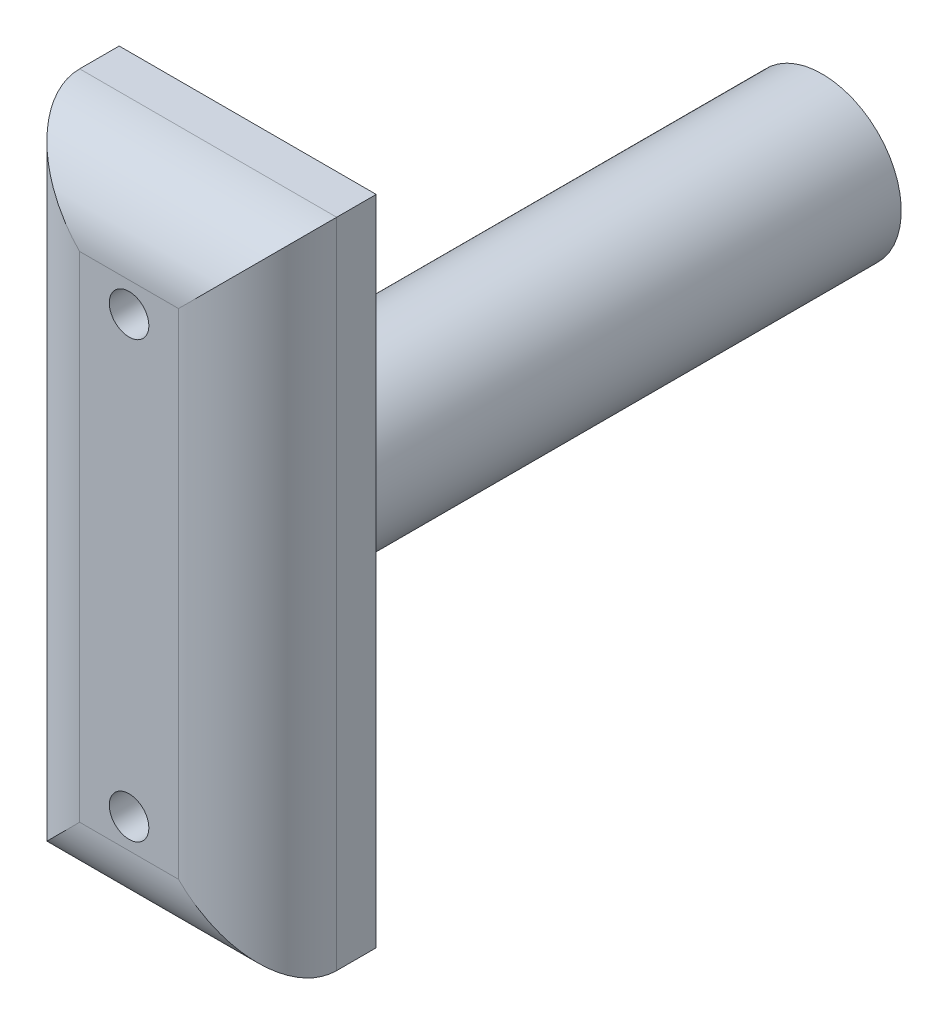
ISO-10303-21;
HEADER;
FILE_DESCRIPTION(('STEP AP214'),'2;1');
FILE_NAME('part.step','',(''),(''),'','','');
FILE_SCHEMA(('AUTOMOTIVE_DESIGN { 1 0 10303 214 1 1 1 1 }'));
ENDSEC;
DATA;
#1=APPLICATION_CONTEXT('core data for automotive mechanical design processes');
#2=APPLICATION_PROTOCOL_DEFINITION('international standard','automotive_design',2000,#1);
#3=PRODUCT_CONTEXT('',#1,'mechanical');
#4=PRODUCT('Part','Part','',(#3));
#5=PRODUCT_RELATED_PRODUCT_CATEGORY('part','',(#4));
#6=PRODUCT_DEFINITION_FORMATION('','',#4);
#7=PRODUCT_DEFINITION_CONTEXT('part definition',#1,'design');
#8=PRODUCT_DEFINITION('design','',#6,#7);
#9=PRODUCT_DEFINITION_SHAPE('','',#8);
#10=(LENGTH_UNIT() NAMED_UNIT(*) SI_UNIT(.MILLI.,.METRE.));
#11=(NAMED_UNIT(*) PLANE_ANGLE_UNIT() SI_UNIT($,.RADIAN.));
#12=(NAMED_UNIT(*) SI_UNIT($,.STERADIAN.) SOLID_ANGLE_UNIT());
#13=UNCERTAINTY_MEASURE_WITH_UNIT(LENGTH_MEASURE(1.E-05),#10,'distance_accuracy_value','');
#14=(GEOMETRIC_REPRESENTATION_CONTEXT(3) GLOBAL_UNCERTAINTY_ASSIGNED_CONTEXT((#13)) GLOBAL_UNIT_ASSIGNED_CONTEXT((#10,
#11,#12)) REPRESENTATION_CONTEXT('',''));
#15=CARTESIAN_POINT('',(0.,0.,0.));
#16=DIRECTION('',(0.,0.,1.));
#17=DIRECTION('',(1.,0.,0.));
#18=AXIS2_PLACEMENT_3D('',#15,#16,#17);
#19=CARTESIAN_POINT('',(-6.5,-16.5,6.));
#20=DIRECTION('',(1.,0.,0.));
#21=DIRECTION('',(0.,0.,-1.));
#22=AXIS2_PLACEMENT_3D('',#19,#20,#21);
#23=PLANE('',#22);
#24=DIRECTION('',(0.,0.,-1.));
#25=VECTOR('',#24,1.);
#26=CARTESIAN_POINT('',(-6.5,-16.5,6.));
#27=LINE('',#26,#25);
#28=CARTESIAN_POINT('',(-6.5,-16.5,2.));
#29=VERTEX_POINT('',#28);
#30=CARTESIAN_POINT('',(-6.5,-16.5,0.));
#31=VERTEX_POINT('',#30);
#32=EDGE_CURVE('E87',#29,#31,#27,.T.);
#33=ORIENTED_EDGE('',*,*,#32,.F.);
#34=DIRECTION('',(0.,-1.,0.));
#35=VECTOR('',#34,1.);
#36=CARTESIAN_POINT('',(-6.5,16.5,2.));
#37=LINE('',#36,#35);
#38=CARTESIAN_POINT('',(-6.5,16.5,2.));
#39=VERTEX_POINT('',#38);
#40=EDGE_CURVE('E133',#29,#39,#37,.F.);
#41=ORIENTED_EDGE('',*,*,#40,.T.);
#42=DIRECTION('',(0.,0.,-1.));
#43=VECTOR('',#42,1.);
#44=CARTESIAN_POINT('',(-6.5,16.5,6.));
#45=LINE('',#44,#43);
#46=CARTESIAN_POINT('',(-6.5,16.5,0.));
#47=VERTEX_POINT('',#46);
#48=EDGE_CURVE('E108',#39,#47,#45,.T.);
#49=ORIENTED_EDGE('',*,*,#48,.T.);
#50=DIRECTION('',(0.,-1.,0.));
#51=VECTOR('',#50,1.);
#52=CARTESIAN_POINT('',(-6.5,-16.5,0.));
#53=LINE('',#52,#51);
#54=EDGE_CURVE('E104',#47,#31,#53,.T.);
#55=ORIENTED_EDGE('',*,*,#54,.T.);
#56=EDGE_LOOP('',(#33,#41,#49,#55));
#57=FACE_BOUND('',#56,.T.);
#58=ADVANCED_FACE('F33',(#57),#23,.F.);
#59=CARTESIAN_POINT('',(6.5,-16.5,6.));
#60=DIRECTION('',(0.,1.,0.));
#61=DIRECTION('',(0.,0.,1.));
#62=AXIS2_PLACEMENT_3D('',#59,#60,#61);
#63=PLANE('',#62);
#64=DIRECTION('',(0.,0.,-1.));
#65=VECTOR('',#64,1.);
#66=CARTESIAN_POINT('',(6.5,-16.5,6.));
#67=LINE('',#66,#65);
#68=CARTESIAN_POINT('',(6.5,-16.5,2.));
#69=VERTEX_POINT('',#68);
#70=CARTESIAN_POINT('',(6.5,-16.5,0.));
#71=VERTEX_POINT('',#70);
#72=EDGE_CURVE('E98',#69,#71,#67,.T.);
#73=ORIENTED_EDGE('',*,*,#72,.F.);
#74=DIRECTION('',(1.,0.,0.));
#75=VECTOR('',#74,1.);
#76=CARTESIAN_POINT('',(-6.5,-16.5,2.));
#77=LINE('',#76,#75);
#78=EDGE_CURVE('E42',#69,#29,#77,.F.);
#79=ORIENTED_EDGE('',*,*,#78,.T.);
#80=ORIENTED_EDGE('',*,*,#32,.T.);
#81=DIRECTION('',(1.,0.,0.));
#82=VECTOR('',#81,1.);
#83=CARTESIAN_POINT('',(6.5,-16.5,0.));
#84=LINE('',#83,#82);
#85=EDGE_CURVE('E90',#31,#71,#84,.T.);
#86=ORIENTED_EDGE('',*,*,#85,.T.);
#87=EDGE_LOOP('',(#73,#79,#80,#86));
#88=FACE_BOUND('',#87,.T.);
#89=ADVANCED_FACE('F89',(#88),#63,.F.);
#90=CARTESIAN_POINT('',(6.5,-16.5,6.));
#91=DIRECTION('',(-1.,0.,0.));
#92=DIRECTION('',(0.,0.,1.));
#93=AXIS2_PLACEMENT_3D('',#90,#91,#92);
#94=PLANE('',#93);
#95=DIRECTION('',(0.,0.,-1.));
#96=VECTOR('',#95,1.);
#97=CARTESIAN_POINT('',(6.5,16.5,6.));
#98=LINE('',#97,#96);
#99=CARTESIAN_POINT('',(6.5,16.5,2.));
#100=VERTEX_POINT('',#99);
#101=CARTESIAN_POINT('',(6.5,16.5,0.));
#102=VERTEX_POINT('',#101);
#103=EDGE_CURVE('E121',#100,#102,#98,.T.);
#104=ORIENTED_EDGE('',*,*,#103,.F.);
#105=DIRECTION('',(0.,1.,0.));
#106=VECTOR('',#105,1.);
#107=CARTESIAN_POINT('',(6.5,-16.5,2.));
#108=LINE('',#107,#106);
#109=EDGE_CURVE('E50',#100,#69,#108,.F.);
#110=ORIENTED_EDGE('',*,*,#109,.T.);
#111=ORIENTED_EDGE('',*,*,#72,.T.);
#112=DIRECTION('',(0.,1.,0.));
#113=VECTOR('',#112,1.);
#114=CARTESIAN_POINT('',(6.5,-16.5,0.));
#115=LINE('',#114,#113);
#116=EDGE_CURVE('E106',#71,#102,#115,.T.);
#117=ORIENTED_EDGE('',*,*,#116,.T.);
#118=EDGE_LOOP('',(#104,#110,#111,#117));
#119=FACE_BOUND('',#118,.T.);
#120=ADVANCED_FACE('F180',(#119),#94,.F.);
#121=CARTESIAN_POINT('',(6.5,16.5,6.));
#122=DIRECTION('',(0.,-1.,0.));
#123=DIRECTION('',(1.,0.,0.));
#124=AXIS2_PLACEMENT_3D('',#121,#122,#123);
#125=PLANE('',#124);
#126=ORIENTED_EDGE('',*,*,#48,.F.);
#127=DIRECTION('',(-1.,0.,0.));
#128=VECTOR('',#127,1.);
#129=CARTESIAN_POINT('',(6.5,16.5,2.));
#130=LINE('',#129,#128);
#131=EDGE_CURVE('E11',#39,#100,#130,.F.);
#132=ORIENTED_EDGE('',*,*,#131,.T.);
#133=ORIENTED_EDGE('',*,*,#103,.T.);
#134=DIRECTION('',(-1.,0.,0.));
#135=VECTOR('',#134,1.);
#136=CARTESIAN_POINT('',(6.5,16.5,0.));
#137=LINE('',#136,#135);
#138=EDGE_CURVE('E118',#102,#47,#137,.T.);
#139=ORIENTED_EDGE('',*,*,#138,.T.);
#140=EDGE_LOOP('',(#126,#132,#133,#139));
#141=FACE_BOUND('',#140,.T.);
#142=ADVANCED_FACE('F170',(#141),#125,.F.);
#143=CARTESIAN_POINT('',(0.,0.,6.));
#144=DIRECTION('',(0.,0.,1.));
#145=DIRECTION('',(1.,0.,0.));
#146=AXIS2_PLACEMENT_3D('',#143,#144,#145);
#147=PLANE('',#146);
#148=DIRECTION('',(0.,-1.,0.));
#149=VECTOR('',#148,1.);
#150=CARTESIAN_POINT('',(-2.5,-16.5,6.));
#151=LINE('',#150,#149);
#152=CARTESIAN_POINT('',(-2.5,12.5,6.));
#153=VERTEX_POINT('',#152);
#154=CARTESIAN_POINT('',(-2.5,-12.5,6.));
#155=VERTEX_POINT('',#154);
#156=EDGE_CURVE('E128',#153,#155,#151,.T.);
#157=ORIENTED_EDGE('',*,*,#156,.T.);
#158=DIRECTION('',(1.,0.,0.));
#159=VECTOR('',#158,1.);
#160=CARTESIAN_POINT('',(6.5,-12.5,6.));
#161=LINE('',#160,#159);
#162=CARTESIAN_POINT('',(2.5,-12.5,6.));
#163=VERTEX_POINT('',#162);
#164=EDGE_CURVE('E131',#155,#163,#161,.T.);
#165=ORIENTED_EDGE('',*,*,#164,.T.);
#166=DIRECTION('',(0.,1.,0.));
#167=VECTOR('',#166,1.);
#168=CARTESIAN_POINT('',(2.5,16.5,6.));
#169=LINE('',#168,#167);
#170=CARTESIAN_POINT('',(2.5,12.5,6.));
#171=VERTEX_POINT('',#170);
#172=EDGE_CURVE('E126',#163,#171,#169,.T.);
#173=ORIENTED_EDGE('',*,*,#172,.T.);
#174=DIRECTION('',(-1.,0.,0.));
#175=VECTOR('',#174,1.);
#176=CARTESIAN_POINT('',(-6.5,12.5,6.));
#177=LINE('',#176,#175);
#178=EDGE_CURVE('E124',#171,#153,#177,.T.);
#179=ORIENTED_EDGE('',*,*,#178,.T.);
#180=EDGE_LOOP('',(#157,#165,#173,#179));
#181=FACE_BOUND('',#180,.T.);
#182=CARTESIAN_POINT('',(0.,11.,6.));
#183=DIRECTION('',(0.,0.,1.));
#184=DIRECTION('',(1.,0.,0.));
#185=AXIS2_PLACEMENT_3D('',#182,#183,#184);
#186=CIRCLE('',#185,1.);
#187=CARTESIAN_POINT('',(1.,11.,6.));
#188=VERTEX_POINT('',#187);
#189=EDGE_CURVE('E156',#188,#188,#186,.T.);
#190=ORIENTED_EDGE('',*,*,#189,.F.);
#191=EDGE_LOOP('',(#190));
#192=FACE_BOUND('',#191,.T.);
#193=CARTESIAN_POINT('',(0.,-11.,6.));
#194=DIRECTION('',(0.,0.,1.));
#195=DIRECTION('',(1.,0.,0.));
#196=AXIS2_PLACEMENT_3D('',#193,#194,#195);
#197=CIRCLE('',#196,1.);
#198=CARTESIAN_POINT('',(1.,-11.,6.));
#199=VERTEX_POINT('',#198);
#200=EDGE_CURVE('E146',#199,#199,#197,.T.);
#201=ORIENTED_EDGE('',*,*,#200,.F.);
#202=EDGE_LOOP('',(#201));
#203=FACE_BOUND('',#202,.T.);
#204=ADVANCED_FACE('F167',(#181,#192,#203),#147,.T.);
#205=CARTESIAN_POINT('',(0.,0.,0.));
#206=DIRECTION('',(0.,0.,1.));
#207=DIRECTION('',(1.,0.,0.));
#208=AXIS2_PLACEMENT_3D('',#205,#206,#207);
#209=PLANE('',#208);
#210=CARTESIAN_POINT('',(0.,11.,0.));
#211=DIRECTION('',(0.,0.,1.));
#212=DIRECTION('',(1.,0.,0.));
#213=AXIS2_PLACEMENT_3D('',#210,#211,#212);
#214=CIRCLE('',#213,1.);
#215=CARTESIAN_POINT('',(1.,11.,0.));
#216=VERTEX_POINT('',#215);
#217=EDGE_CURVE('E113',#216,#216,#214,.F.);
#218=ORIENTED_EDGE('',*,*,#217,.F.);
#219=EDGE_LOOP('',(#218));
#220=FACE_BOUND('',#219,.T.);
#221=CARTESIAN_POINT('',(0.,-11.,0.));
#222=DIRECTION('',(0.,0.,1.));
#223=DIRECTION('',(1.,0.,0.));
#224=AXIS2_PLACEMENT_3D('',#221,#222,#223);
#225=CIRCLE('',#224,1.);
#226=CARTESIAN_POINT('',(1.,-11.,0.));
#227=VERTEX_POINT('',#226);
#228=EDGE_CURVE('E151',#227,#227,#225,.F.);
#229=ORIENTED_EDGE('',*,*,#228,.F.);
#230=EDGE_LOOP('',(#229));
#231=FACE_BOUND('',#230,.T.);
#232=CARTESIAN_POINT('',(0.,0.,0.));
#233=DIRECTION('',(0.,0.,-1.));
#234=DIRECTION('',(-1.,0.,0.));
#235=AXIS2_PLACEMENT_3D('',#232,#233,#234);
#236=CIRCLE('',#235,4.);
#237=CARTESIAN_POINT('',(-4.,0.,0.));
#238=VERTEX_POINT('',#237);
#239=EDGE_CURVE('E97',#238,#238,#236,.T.);
#240=ORIENTED_EDGE('',*,*,#239,.F.);
#241=EDGE_LOOP('',(#240));
#242=FACE_BOUND('',#241,.T.);
#243=ORIENTED_EDGE('',*,*,#54,.F.);
#244=ORIENTED_EDGE('',*,*,#138,.F.);
#245=ORIENTED_EDGE('',*,*,#116,.F.);
#246=ORIENTED_EDGE('',*,*,#85,.F.);
#247=EDGE_LOOP('',(#243,#244,#245,#246));
#248=FACE_BOUND('',#247,.T.);
#249=ADVANCED_FACE('F102',(#220,#231,#242,#248),#209,.F.);
#250=CARTESIAN_POINT('',(0.,0.,-29.05598176));
#251=DIRECTION('',(0.,0.,1.));
#252=DIRECTION('',(1.,0.,0.));
#253=AXIS2_PLACEMENT_3D('',#250,#251,#252);
#254=CYLINDRICAL_SURFACE('',#253,4.);
#255=CARTESIAN_POINT('',(0.,0.,-29.05598176));
#256=DIRECTION('',(0.,0.,-1.));
#257=DIRECTION('',(-1.,0.,0.));
#258=AXIS2_PLACEMENT_3D('',#255,#256,#257);
#259=CIRCLE('',#258,4.);
#260=CARTESIAN_POINT('',(-4.,0.,-29.05598176));
#261=VERTEX_POINT('',#260);
#262=EDGE_CURVE('E110',#261,#261,#259,.T.);
#263=ORIENTED_EDGE('',*,*,#262,.F.);
#264=EDGE_LOOP('',(#263));
#265=FACE_BOUND('',#264,.T.);
#266=ORIENTED_EDGE('',*,*,#239,.T.);
#267=EDGE_LOOP('',(#266));
#268=FACE_BOUND('',#267,.T.);
#269=ADVANCED_FACE('F177',(#265,#268),#254,.T.);
#270=CARTESIAN_POINT('',(0.,0.,-29.05598176));
#271=DIRECTION('',(0.,0.,-1.));
#272=DIRECTION('',(-1.,0.,0.));
#273=AXIS2_PLACEMENT_3D('',#270,#271,#272);
#274=PLANE('',#273);
#275=ORIENTED_EDGE('',*,*,#262,.T.);
#276=EDGE_LOOP('',(#275));
#277=FACE_BOUND('',#276,.T.);
#278=ADVANCED_FACE('F261',(#277),#274,.T.);
#279=CARTESIAN_POINT('',(0.,-11.,-29.05698176));
#280=DIRECTION('',(0.,0.,1.));
#281=DIRECTION('',(1.,0.,0.));
#282=AXIS2_PLACEMENT_3D('',#279,#280,#281);
#283=CYLINDRICAL_SURFACE('',#282,1.);
#284=ORIENTED_EDGE('',*,*,#200,.T.);
#285=EDGE_LOOP('',(#284));
#286=FACE_BOUND('',#285,.T.);
#287=ORIENTED_EDGE('',*,*,#228,.T.);
#288=EDGE_LOOP('',(#287));
#289=FACE_BOUND('',#288,.T.);
#290=ADVANCED_FACE('F206',(#286,#289),#283,.F.);
#291=CARTESIAN_POINT('',(0.,11.,-29.05698176));
#292=DIRECTION('',(0.,0.,1.));
#293=DIRECTION('',(1.,0.,0.));
#294=AXIS2_PLACEMENT_3D('',#291,#292,#293);
#295=CYLINDRICAL_SURFACE('',#294,1.);
#296=ORIENTED_EDGE('',*,*,#189,.T.);
#297=EDGE_LOOP('',(#296));
#298=FACE_BOUND('',#297,.T.);
#299=ORIENTED_EDGE('',*,*,#217,.T.);
#300=EDGE_LOOP('',(#299));
#301=FACE_BOUND('',#300,.T.);
#302=ADVANCED_FACE('F164',(#298,#301),#295,.F.);
#303=CARTESIAN_POINT('',(2.5,0.,2.));
#304=DIRECTION('',(0.,-1.,0.));
#305=DIRECTION('',(0.,0.,-1.));
#306=AXIS2_PLACEMENT_3D('',#303,#304,#305);
#307=CYLINDRICAL_SURFACE('',#306,4.);
#308=CARTESIAN_POINT('',(2.5,-12.5,2.));
#309=DIRECTION('',(-0.707106781186547,-0.707106781186547,0.));
#310=DIRECTION('',(-0.707106781186547,0.707106781186547,0.));
#311=AXIS2_PLACEMENT_3D('',#308,#309,#310);
#312=ELLIPSE('',#311,5.65685424949238,4.);
#313=EDGE_CURVE('E140',#69,#163,#312,.T.);
#314=ORIENTED_EDGE('',*,*,#313,.F.);
#315=ORIENTED_EDGE('',*,*,#109,.F.);
#316=CARTESIAN_POINT('',(2.5,12.5,2.));
#317=DIRECTION('',(0.707106781186547,-0.707106781186548,0.));
#318=DIRECTION('',(0.707106781186548,0.707106781186547,0.));
#319=AXIS2_PLACEMENT_3D('',#316,#317,#318);
#320=ELLIPSE('',#319,5.65685424949238,4.);
#321=EDGE_CURVE('E37',#171,#100,#320,.F.);
#322=ORIENTED_EDGE('',*,*,#321,.F.);
#323=ORIENTED_EDGE('',*,*,#172,.F.);
#324=EDGE_LOOP('',(#314,#315,#322,#323));
#325=FACE_BOUND('',#324,.T.);
#326=ADVANCED_FACE('F35',(#325),#307,.T.);
#327=CARTESIAN_POINT('',(0.,12.5,2.));
#328=DIRECTION('',(1.,0.,0.));
#329=DIRECTION('',(0.,1.,0.));
#330=AXIS2_PLACEMENT_3D('',#327,#328,#329);
#331=CYLINDRICAL_SURFACE('',#330,4.);
#332=ORIENTED_EDGE('',*,*,#321,.T.);
#333=ORIENTED_EDGE('',*,*,#131,.F.);
#334=CARTESIAN_POINT('',(-2.5,12.5,2.));
#335=DIRECTION('',(0.707106781186548,0.707106781186547,0.));
#336=DIRECTION('',(0.707106781186547,-0.707106781186548,0.));
#337=AXIS2_PLACEMENT_3D('',#334,#335,#336);
#338=ELLIPSE('',#337,5.65685424949238,4.);
#339=EDGE_CURVE('E139',#153,#39,#338,.F.);
#340=ORIENTED_EDGE('',*,*,#339,.F.);
#341=ORIENTED_EDGE('',*,*,#178,.F.);
#342=EDGE_LOOP('',(#332,#333,#340,#341));
#343=FACE_BOUND('',#342,.T.);
#344=ADVANCED_FACE('F197',(#343),#331,.T.);
#345=CARTESIAN_POINT('',(0.,-12.5,2.));
#346=DIRECTION('',(-1.,0.,0.));
#347=DIRECTION('',(0.,0.,1.));
#348=AXIS2_PLACEMENT_3D('',#345,#346,#347);
#349=CYLINDRICAL_SURFACE('',#348,4.);
#350=ORIENTED_EDGE('',*,*,#313,.T.);
#351=ORIENTED_EDGE('',*,*,#164,.F.);
#352=CARTESIAN_POINT('',(-2.5,-12.5,2.));
#353=DIRECTION('',(-0.707106781186547,0.707106781186547,0.));
#354=DIRECTION('',(-0.707106781186547,-0.707106781186547,0.));
#355=AXIS2_PLACEMENT_3D('',#352,#353,#354);
#356=ELLIPSE('',#355,5.65685424949238,4.);
#357=EDGE_CURVE('E137',#29,#155,#356,.T.);
#358=ORIENTED_EDGE('',*,*,#357,.F.);
#359=ORIENTED_EDGE('',*,*,#78,.F.);
#360=EDGE_LOOP('',(#350,#351,#358,#359));
#361=FACE_BOUND('',#360,.T.);
#362=ADVANCED_FACE('F194',(#361),#349,.T.);
#363=CARTESIAN_POINT('',(-2.5,0.,2.));
#364=DIRECTION('',(0.,1.,0.));
#365=DIRECTION('',(0.,0.,1.));
#366=AXIS2_PLACEMENT_3D('',#363,#364,#365);
#367=CYLINDRICAL_SURFACE('',#366,4.);
#368=ORIENTED_EDGE('',*,*,#339,.T.);
#369=ORIENTED_EDGE('',*,*,#40,.F.);
#370=ORIENTED_EDGE('',*,*,#357,.T.);
#371=ORIENTED_EDGE('',*,*,#156,.F.);
#372=EDGE_LOOP('',(#368,#369,#370,#371));
#373=FACE_BOUND('',#372,.T.);
#374=ADVANCED_FACE('F191',(#373),#367,.T.);
#375=CLOSED_SHELL('',(#58,#89,#120,#142,#204,#249,#269,#278,#290,#302,#326,#344,#362,#374));
#376=MANIFOLD_SOLID_BREP('B2',#375);
#377=ADVANCED_BREP_SHAPE_REPRESENTATION('',(#18,#376),#14);
#378=SHAPE_DEFINITION_REPRESENTATION(#9,#377);
ENDSEC;
END-ISO-10303-21;
